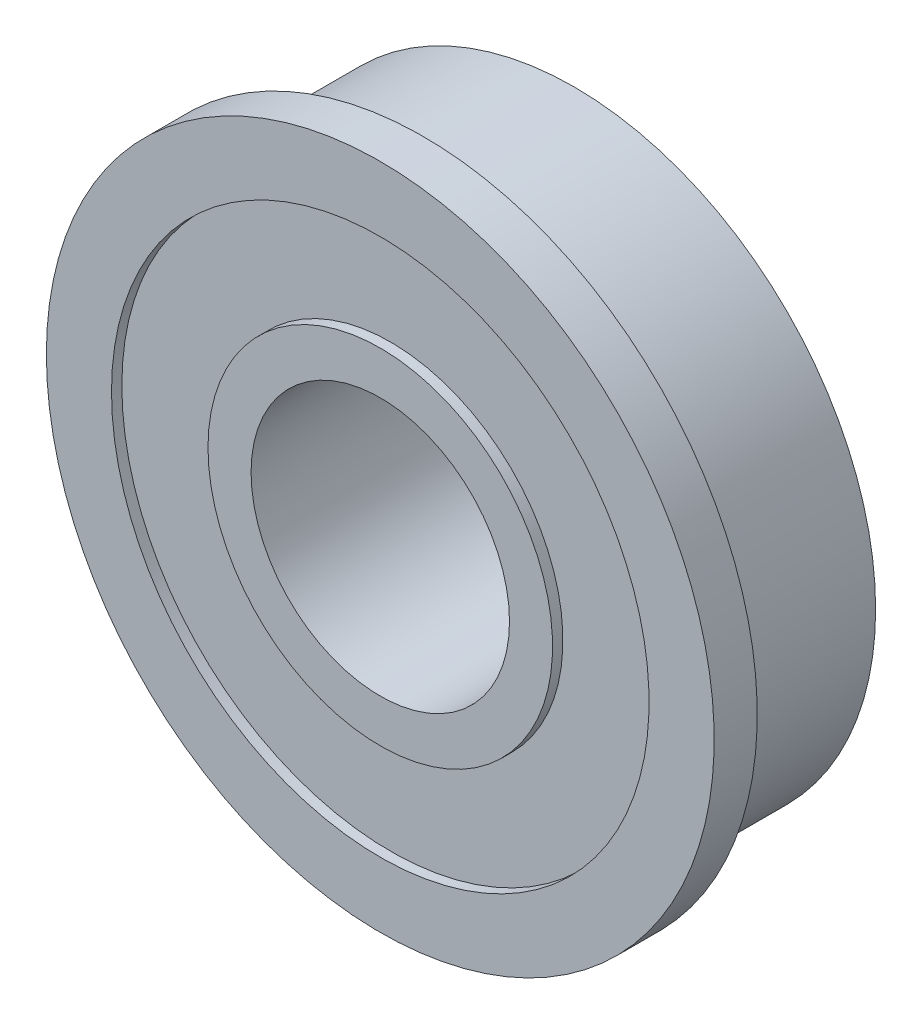
ISO-10303-21;
HEADER;
FILE_DESCRIPTION(('STEP AP214'),'2;1');
FILE_NAME('part.step','',(''),(''),'','','');
FILE_SCHEMA(('AUTOMOTIVE_DESIGN { 1 0 10303 214 1 1 1 1 }'));
ENDSEC;
DATA;
#1=APPLICATION_CONTEXT('core data for automotive mechanical design processes');
#2=APPLICATION_PROTOCOL_DEFINITION('international standard','automotive_design',2000,#1);
#3=PRODUCT_CONTEXT('',#1,'mechanical');
#4=PRODUCT('Part','Part','',(#3));
#5=PRODUCT_RELATED_PRODUCT_CATEGORY('part','',(#4));
#6=PRODUCT_DEFINITION_FORMATION('','',#4);
#7=PRODUCT_DEFINITION_CONTEXT('part definition',#1,'design');
#8=PRODUCT_DEFINITION('design','',#6,#7);
#9=PRODUCT_DEFINITION_SHAPE('','',#8);
#10=(LENGTH_UNIT() NAMED_UNIT(*) SI_UNIT(.MILLI.,.METRE.));
#11=(NAMED_UNIT(*) PLANE_ANGLE_UNIT() SI_UNIT($,.RADIAN.));
#12=(NAMED_UNIT(*) SI_UNIT($,.STERADIAN.) SOLID_ANGLE_UNIT());
#13=UNCERTAINTY_MEASURE_WITH_UNIT(LENGTH_MEASURE(1.E-05),#10,'distance_accuracy_value','');
#14=(GEOMETRIC_REPRESENTATION_CONTEXT(3) GLOBAL_UNCERTAINTY_ASSIGNED_CONTEXT((#13)) GLOBAL_UNIT_ASSIGNED_CONTEXT((#10,
#11,#12)) REPRESENTATION_CONTEXT('',''));
#15=CARTESIAN_POINT('',(0.,0.,0.));
#16=DIRECTION('',(0.,0.,1.));
#17=DIRECTION('',(1.,0.,0.));
#18=AXIS2_PLACEMENT_3D('',#15,#16,#17);
#19=CARTESIAN_POINT('',(0.,0.,0.));
#20=DIRECTION('',(0.,0.,-1.));
#21=DIRECTION('',(-1.,0.,0.));
#22=AXIS2_PLACEMENT_3D('',#19,#20,#21);
#23=CYLINDRICAL_SURFACE('',#22,4.7625);
#24=CARTESIAN_POINT('',(0.,0.,7.14375));
#25=DIRECTION('',(0.,0.,-1.));
#26=DIRECTION('',(-1.,0.,0.));
#27=AXIS2_PLACEMENT_3D('',#24,#25,#26);
#28=CIRCLE('',#27,4.7625);
#29=CARTESIAN_POINT('',(-4.7625,0.,7.14375));
#30=VERTEX_POINT('',#29);
#31=EDGE_CURVE('E75',#30,#30,#28,.T.);
#32=ORIENTED_EDGE('',*,*,#31,.F.);
#33=EDGE_LOOP('',(#32));
#34=FACE_BOUND('',#33,.T.);
#35=CARTESIAN_POINT('',(0.,0.,0.));
#36=DIRECTION('',(0.,0.,-1.));
#37=DIRECTION('',(-1.,0.,0.));
#38=AXIS2_PLACEMENT_3D('',#35,#36,#37);
#39=CIRCLE('',#38,4.7625);
#40=CARTESIAN_POINT('',(-4.7625,0.,0.));
#41=VERTEX_POINT('',#40);
#42=EDGE_CURVE('E10',#41,#41,#39,.T.);
#43=ORIENTED_EDGE('',*,*,#42,.T.);
#44=EDGE_LOOP('',(#43));
#45=FACE_BOUND('',#44,.T.);
#46=ADVANCED_FACE('F15',(#34,#45),#23,.F.);
#47=CARTESIAN_POINT('',(5.55625,0.,0.));
#48=DIRECTION('',(0.,0.,1.));
#49=DIRECTION('',(1.,0.,0.));
#50=AXIS2_PLACEMENT_3D('',#47,#48,#49);
#51=PLANE('',#50);
#52=ORIENTED_EDGE('',*,*,#42,.F.);
#53=EDGE_LOOP('',(#52));
#54=FACE_BOUND('',#53,.T.);
#55=CARTESIAN_POINT('',(0.,0.,0.));
#56=DIRECTION('',(0.,0.,-1.));
#57=DIRECTION('',(-1.,0.,0.));
#58=AXIS2_PLACEMENT_3D('',#55,#56,#57);
#59=CIRCLE('',#58,6.35);
#60=CARTESIAN_POINT('',(-6.35,0.,0.));
#61=VERTEX_POINT('',#60);
#62=EDGE_CURVE('E22',#61,#61,#59,.T.);
#63=ORIENTED_EDGE('',*,*,#62,.T.);
#64=EDGE_LOOP('',(#63));
#65=FACE_BOUND('',#64,.T.);
#66=ADVANCED_FACE('F83',(#54,#65),#51,.F.);
#67=CARTESIAN_POINT('',(0.,0.,0.));
#68=DIRECTION('',(0.,0.,-1.));
#69=DIRECTION('',(-1.,0.,0.));
#70=AXIS2_PLACEMENT_3D('',#67,#68,#69);
#71=CYLINDRICAL_SURFACE('',#70,6.35);
#72=ORIENTED_EDGE('',*,*,#62,.F.);
#73=EDGE_LOOP('',(#72));
#74=FACE_BOUND('',#73,.T.);
#75=CARTESIAN_POINT('',(0.,0.,0.381));
#76=DIRECTION('',(0.,0.,-1.));
#77=DIRECTION('',(-1.,0.,0.));
#78=AXIS2_PLACEMENT_3D('',#75,#76,#77);
#79=CIRCLE('',#78,6.35);
#80=CARTESIAN_POINT('',(-6.35,0.,0.381));
#81=VERTEX_POINT('',#80);
#82=EDGE_CURVE('E30',#81,#81,#79,.T.);
#83=ORIENTED_EDGE('',*,*,#82,.T.);
#84=EDGE_LOOP('',(#83));
#85=FACE_BOUND('',#84,.T.);
#86=ADVANCED_FACE('F87',(#74,#85),#71,.T.);
#87=CARTESIAN_POINT('',(8.128,0.,0.381));
#88=DIRECTION('',(0.,0.,1.));
#89=DIRECTION('',(1.,0.,0.));
#90=AXIS2_PLACEMENT_3D('',#87,#88,#89);
#91=PLANE('',#90);
#92=ORIENTED_EDGE('',*,*,#82,.F.);
#93=EDGE_LOOP('',(#92));
#94=FACE_BOUND('',#93,.T.);
#95=CARTESIAN_POINT('',(0.,0.,0.381));
#96=DIRECTION('',(0.,0.,-1.));
#97=DIRECTION('',(-1.,0.,0.));
#98=AXIS2_PLACEMENT_3D('',#95,#96,#97);
#99=CIRCLE('',#98,9.906);
#100=CARTESIAN_POINT('',(-9.906,0.,0.381));
#101=VERTEX_POINT('',#100);
#102=EDGE_CURVE('E36',#101,#101,#99,.T.);
#103=ORIENTED_EDGE('',*,*,#102,.T.);
#104=EDGE_LOOP('',(#103));
#105=FACE_BOUND('',#104,.T.);
#106=ADVANCED_FACE('F91',(#94,#105),#91,.F.);
#107=CARTESIAN_POINT('',(0.,0.,0.));
#108=DIRECTION('',(0.,0.,-1.));
#109=DIRECTION('',(-1.,0.,0.));
#110=AXIS2_PLACEMENT_3D('',#107,#108,#109);
#111=CYLINDRICAL_SURFACE('',#110,9.906);
#112=ORIENTED_EDGE('',*,*,#102,.F.);
#113=EDGE_LOOP('',(#112));
#114=FACE_BOUND('',#113,.T.);
#115=CARTESIAN_POINT('',(0.,0.,0.));
#116=DIRECTION('',(0.,0.,-1.));
#117=DIRECTION('',(-1.,0.,0.));
#118=AXIS2_PLACEMENT_3D('',#115,#116,#117);
#119=CIRCLE('',#118,9.906);
#120=CARTESIAN_POINT('',(-9.906,0.,0.));
#121=VERTEX_POINT('',#120);
#122=EDGE_CURVE('E42',#121,#121,#119,.T.);
#123=ORIENTED_EDGE('',*,*,#122,.T.);
#124=EDGE_LOOP('',(#123));
#125=FACE_BOUND('',#124,.T.);
#126=ADVANCED_FACE('F97',(#114,#125),#111,.F.);
#127=CARTESIAN_POINT('',(10.50925,0.,0.));
#128=DIRECTION('',(0.,0.,1.));
#129=DIRECTION('',(1.,0.,0.));
#130=AXIS2_PLACEMENT_3D('',#127,#128,#129);
#131=PLANE('',#130);
#132=ORIENTED_EDGE('',*,*,#122,.F.);
#133=EDGE_LOOP('',(#132));
#134=FACE_BOUND('',#133,.T.);
#135=CARTESIAN_POINT('',(0.,0.,0.));
#136=DIRECTION('',(0.,0.,-1.));
#137=DIRECTION('',(-1.,0.,0.));
#138=AXIS2_PLACEMENT_3D('',#135,#136,#137);
#139=CIRCLE('',#138,11.1125);
#140=CARTESIAN_POINT('',(-11.1125,0.,0.));
#141=VERTEX_POINT('',#140);
#142=EDGE_CURVE('E45',#141,#141,#139,.T.);
#143=ORIENTED_EDGE('',*,*,#142,.T.);
#144=EDGE_LOOP('',(#143));
#145=FACE_BOUND('',#144,.T.);
#146=ADVANCED_FACE('F101',(#134,#145),#131,.F.);
#147=CARTESIAN_POINT('',(0.,0.,0.));
#148=DIRECTION('',(0.,0.,-1.));
#149=DIRECTION('',(-1.,0.,0.));
#150=AXIS2_PLACEMENT_3D('',#147,#148,#149);
#151=CYLINDRICAL_SURFACE('',#150,11.1125);
#152=ORIENTED_EDGE('',*,*,#142,.F.);
#153=EDGE_LOOP('',(#152));
#154=FACE_BOUND('',#153,.T.);
#155=CARTESIAN_POINT('',(0.,0.,5.55625));
#156=DIRECTION('',(0.,0.,-1.));
#157=DIRECTION('',(-1.,0.,0.));
#158=AXIS2_PLACEMENT_3D('',#155,#156,#157);
#159=CIRCLE('',#158,11.1125);
#160=CARTESIAN_POINT('',(-11.1125,0.,5.55625));
#161=VERTEX_POINT('',#160);
#162=EDGE_CURVE('E49',#161,#161,#159,.T.);
#163=ORIENTED_EDGE('',*,*,#162,.T.);
#164=EDGE_LOOP('',(#163));
#165=FACE_BOUND('',#164,.T.);
#166=ADVANCED_FACE('F105',(#154,#165),#151,.T.);
#167=CARTESIAN_POINT('',(11.7094,0.,5.55625));
#168=DIRECTION('',(0.,0.,1.));
#169=DIRECTION('',(1.,0.,0.));
#170=AXIS2_PLACEMENT_3D('',#167,#168,#169);
#171=PLANE('',#170);
#172=ORIENTED_EDGE('',*,*,#162,.F.);
#173=EDGE_LOOP('',(#172));
#174=FACE_BOUND('',#173,.T.);
#175=CARTESIAN_POINT('',(0.,0.,5.55625));
#176=DIRECTION('',(0.,0.,-1.));
#177=DIRECTION('',(-1.,0.,0.));
#178=AXIS2_PLACEMENT_3D('',#175,#176,#177);
#179=CIRCLE('',#178,12.3063);
#180=CARTESIAN_POINT('',(-12.3063,0.,5.55625));
#181=VERTEX_POINT('',#180);
#182=EDGE_CURVE('E53',#181,#181,#179,.T.);
#183=ORIENTED_EDGE('',*,*,#182,.T.);
#184=EDGE_LOOP('',(#183));
#185=FACE_BOUND('',#184,.T.);
#186=ADVANCED_FACE('F109',(#174,#185),#171,.F.);
#187=CARTESIAN_POINT('',(0.,0.,0.));
#188=DIRECTION('',(0.,0.,-1.));
#189=DIRECTION('',(-1.,0.,0.));
#190=AXIS2_PLACEMENT_3D('',#187,#188,#189);
#191=CYLINDRICAL_SURFACE('',#190,12.3063);
#192=ORIENTED_EDGE('',*,*,#182,.F.);
#193=EDGE_LOOP('',(#192));
#194=FACE_BOUND('',#193,.T.);
#195=CARTESIAN_POINT('',(0.,0.,7.14375));
#196=DIRECTION('',(0.,0.,-1.));
#197=DIRECTION('',(-1.,0.,0.));
#198=AXIS2_PLACEMENT_3D('',#195,#196,#197);
#199=CIRCLE('',#198,12.3063);
#200=CARTESIAN_POINT('',(-12.3063,0.,7.14375));
#201=VERTEX_POINT('',#200);
#202=EDGE_CURVE('E57',#201,#201,#199,.T.);
#203=ORIENTED_EDGE('',*,*,#202,.T.);
#204=EDGE_LOOP('',(#203));
#205=FACE_BOUND('',#204,.T.);
#206=ADVANCED_FACE('F113',(#194,#205),#191,.T.);
#207=CARTESIAN_POINT('',(11.10615,0.,7.14375));
#208=DIRECTION('',(0.,0.,-1.));
#209=DIRECTION('',(-1.,0.,0.));
#210=AXIS2_PLACEMENT_3D('',#207,#208,#209);
#211=PLANE('',#210);
#212=ORIENTED_EDGE('',*,*,#202,.F.);
#213=EDGE_LOOP('',(#212));
#214=FACE_BOUND('',#213,.T.);
#215=CARTESIAN_POINT('',(0.,0.,7.14375));
#216=DIRECTION('',(0.,0.,-1.));
#217=DIRECTION('',(-1.,0.,0.));
#218=AXIS2_PLACEMENT_3D('',#215,#216,#217);
#219=CIRCLE('',#218,9.906);
#220=CARTESIAN_POINT('',(-9.906,0.,7.14375));
#221=VERTEX_POINT('',#220);
#222=EDGE_CURVE('E61',#221,#221,#219,.T.);
#223=ORIENTED_EDGE('',*,*,#222,.T.);
#224=EDGE_LOOP('',(#223));
#225=FACE_BOUND('',#224,.T.);
#226=ADVANCED_FACE('F117',(#214,#225),#211,.F.);
#227=CARTESIAN_POINT('',(0.,0.,0.));
#228=DIRECTION('',(0.,0.,-1.));
#229=DIRECTION('',(-1.,0.,0.));
#230=AXIS2_PLACEMENT_3D('',#227,#228,#229);
#231=CYLINDRICAL_SURFACE('',#230,9.906);
#232=ORIENTED_EDGE('',*,*,#222,.F.);
#233=EDGE_LOOP('',(#232));
#234=FACE_BOUND('',#233,.T.);
#235=CARTESIAN_POINT('',(0.,0.,6.76275));
#236=DIRECTION('',(0.,0.,-1.));
#237=DIRECTION('',(-1.,0.,0.));
#238=AXIS2_PLACEMENT_3D('',#235,#236,#237);
#239=CIRCLE('',#238,9.906);
#240=CARTESIAN_POINT('',(-9.906,0.,6.76275));
#241=VERTEX_POINT('',#240);
#242=EDGE_CURVE('E64',#241,#241,#239,.T.);
#243=ORIENTED_EDGE('',*,*,#242,.T.);
#244=EDGE_LOOP('',(#243));
#245=FACE_BOUND('',#244,.T.);
#246=ADVANCED_FACE('F121',(#234,#245),#231,.F.);
#247=CARTESIAN_POINT('',(8.128,0.,6.76275));
#248=DIRECTION('',(0.,0.,-1.));
#249=DIRECTION('',(-1.,0.,0.));
#250=AXIS2_PLACEMENT_3D('',#247,#248,#249);
#251=PLANE('',#250);
#252=ORIENTED_EDGE('',*,*,#242,.F.);
#253=EDGE_LOOP('',(#252));
#254=FACE_BOUND('',#253,.T.);
#255=CARTESIAN_POINT('',(0.,0.,6.76275));
#256=DIRECTION('',(0.,0.,-1.));
#257=DIRECTION('',(-1.,0.,0.));
#258=AXIS2_PLACEMENT_3D('',#255,#256,#257);
#259=CIRCLE('',#258,6.35);
#260=CARTESIAN_POINT('',(-6.35,0.,6.76275));
#261=VERTEX_POINT('',#260);
#262=EDGE_CURVE('E68',#261,#261,#259,.T.);
#263=ORIENTED_EDGE('',*,*,#262,.T.);
#264=EDGE_LOOP('',(#263));
#265=FACE_BOUND('',#264,.T.);
#266=ADVANCED_FACE('F125',(#254,#265),#251,.F.);
#267=CARTESIAN_POINT('',(0.,0.,0.));
#268=DIRECTION('',(0.,0.,-1.));
#269=DIRECTION('',(-1.,0.,0.));
#270=AXIS2_PLACEMENT_3D('',#267,#268,#269);
#271=CYLINDRICAL_SURFACE('',#270,6.35);
#272=ORIENTED_EDGE('',*,*,#262,.F.);
#273=EDGE_LOOP('',(#272));
#274=FACE_BOUND('',#273,.T.);
#275=CARTESIAN_POINT('',(0.,0.,7.14375));
#276=DIRECTION('',(0.,0.,-1.));
#277=DIRECTION('',(-1.,0.,0.));
#278=AXIS2_PLACEMENT_3D('',#275,#276,#277);
#279=CIRCLE('',#278,6.35);
#280=CARTESIAN_POINT('',(-6.35,0.,7.14375));
#281=VERTEX_POINT('',#280);
#282=EDGE_CURVE('E72',#281,#281,#279,.T.);
#283=ORIENTED_EDGE('',*,*,#282,.T.);
#284=EDGE_LOOP('',(#283));
#285=FACE_BOUND('',#284,.T.);
#286=ADVANCED_FACE('F129',(#274,#285),#271,.T.);
#287=CARTESIAN_POINT('',(5.55625,0.,7.14375));
#288=DIRECTION('',(0.,0.,-1.));
#289=DIRECTION('',(-1.,0.,0.));
#290=AXIS2_PLACEMENT_3D('',#287,#288,#289);
#291=PLANE('',#290);
#292=ORIENTED_EDGE('',*,*,#282,.F.);
#293=EDGE_LOOP('',(#292));
#294=FACE_BOUND('',#293,.T.);
#295=ORIENTED_EDGE('',*,*,#31,.T.);
#296=EDGE_LOOP('',(#295));
#297=FACE_BOUND('',#296,.T.);
#298=ADVANCED_FACE('F80',(#294,#297),#291,.F.);
#299=CLOSED_SHELL('',(#46,#66,#86,#106,#126,#146,#166,#186,#206,#226,#246,#266,#286,#298));
#300=MANIFOLD_SOLID_BREP('B1',#299);
#301=ADVANCED_BREP_SHAPE_REPRESENTATION('',(#18,#300),#14);
#302=SHAPE_DEFINITION_REPRESENTATION(#9,#301);
ENDSEC;
END-ISO-10303-21;
